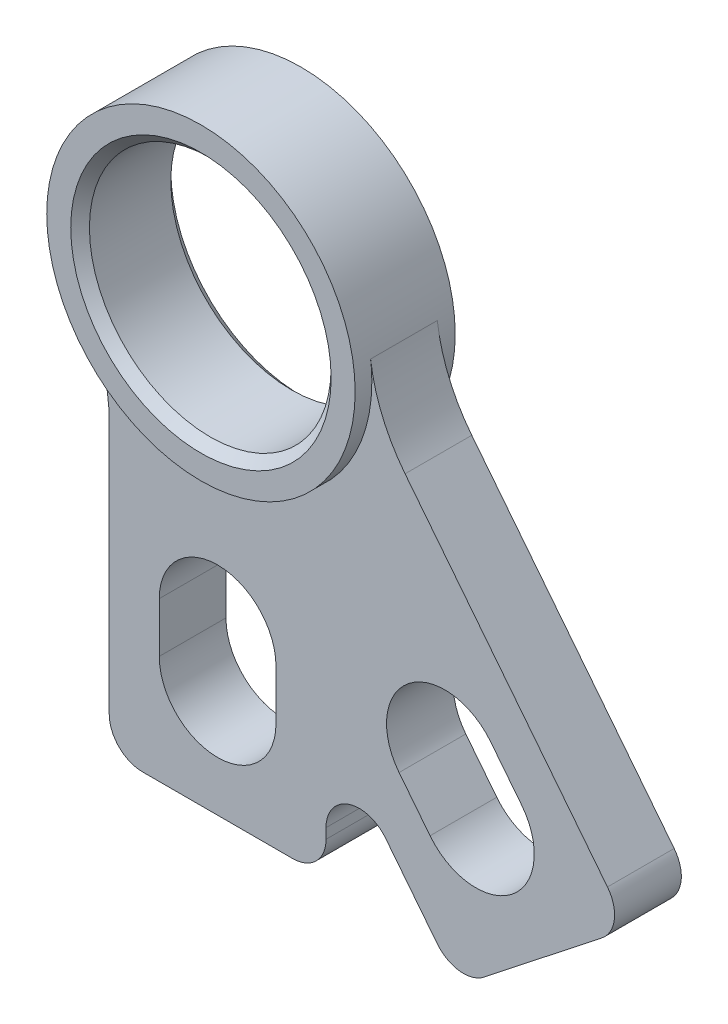
ISO-10303-21;
HEADER;
FILE_DESCRIPTION(('STEP AP214'),'2;1');
FILE_NAME('part.step','',(''),(''),'','','');
FILE_SCHEMA(('AUTOMOTIVE_DESIGN { 1 0 10303 214 1 1 1 1 }'));
ENDSEC;
DATA;
#1=APPLICATION_CONTEXT('core data for automotive mechanical design processes');
#2=APPLICATION_PROTOCOL_DEFINITION('international standard','automotive_design',2000,#1);
#3=PRODUCT_CONTEXT('',#1,'mechanical');
#4=PRODUCT('Part','Part','',(#3));
#5=PRODUCT_RELATED_PRODUCT_CATEGORY('part','',(#4));
#6=PRODUCT_DEFINITION_FORMATION('','',#4);
#7=PRODUCT_DEFINITION_CONTEXT('part definition',#1,'design');
#8=PRODUCT_DEFINITION('design','',#6,#7);
#9=PRODUCT_DEFINITION_SHAPE('','',#8);
#10=(LENGTH_UNIT() NAMED_UNIT(*) SI_UNIT(.MILLI.,.METRE.));
#11=(NAMED_UNIT(*) PLANE_ANGLE_UNIT() SI_UNIT($,.RADIAN.));
#12=(NAMED_UNIT(*) SI_UNIT($,.STERADIAN.) SOLID_ANGLE_UNIT());
#13=UNCERTAINTY_MEASURE_WITH_UNIT(LENGTH_MEASURE(1.E-05),#10,'distance_accuracy_value','');
#14=(GEOMETRIC_REPRESENTATION_CONTEXT(3) GLOBAL_UNCERTAINTY_ASSIGNED_CONTEXT((#13)) GLOBAL_UNIT_ASSIGNED_CONTEXT((#10,
#11,#12)) REPRESENTATION_CONTEXT('',''));
#15=CARTESIAN_POINT('',(0.,0.,0.));
#16=DIRECTION('',(0.,0.,1.));
#17=DIRECTION('',(1.,0.,0.));
#18=AXIS2_PLACEMENT_3D('',#15,#16,#17);
#19=CARTESIAN_POINT('',(0.,0.,4.7625));
#20=DIRECTION('',(0.,0.,-1.));
#21=DIRECTION('',(-1.,0.,0.));
#22=AXIS2_PLACEMENT_3D('',#19,#20,#21);
#23=CYLINDRICAL_SURFACE('',#22,11.5062);
#24=CARTESIAN_POINT('',(0.,0.,-3.87350000000003));
#25=DIRECTION('',(0.,0.,1.));
#26=DIRECTION('',(1.,0.,0.));
#27=AXIS2_PLACEMENT_3D('',#24,#25,#26);
#28=CIRCLE('',#27,11.5062);
#29=CARTESIAN_POINT('',(-11.5062,0.,-3.87350000000003));
#30=VERTEX_POINT('',#29);
#31=EDGE_CURVE('E44',#30,#30,#28,.F.);
#32=CARTESIAN_POINT('',(0.,0.,3.87349999999998));
#33=DIRECTION('',(0.,0.,1.));
#34=DIRECTION('',(1.,0.,0.));
#35=AXIS2_PLACEMENT_3D('',#32,#33,#34);
#36=CIRCLE('',#35,11.5062);
#37=CARTESIAN_POINT('',(-11.5062,0.,3.87349999999998));
#38=VERTEX_POINT('',#37);
#39=EDGE_CURVE('E371',#38,#38,#36,.T.);
#40=CARTESIAN_POINT('',(-11.5062,0.,-3.87350000000003));
#41=CARTESIAN_POINT('',(-11.5062,0.,-3.79280208333336));
#42=CARTESIAN_POINT('',(-11.5062,0.,-3.7121041666667));
#43=CARTESIAN_POINT('',(-11.5062,0.,-3.55070833333336));
#44=CARTESIAN_POINT('',(-11.5062,0.,-3.4700104166667));
#45=CARTESIAN_POINT('',(-11.5062,0.,-3.30861458333336));
#46=CARTESIAN_POINT('',(-11.5062,0.,-3.2279166666667));
#47=CARTESIAN_POINT('',(-11.5062,0.,-3.06652083333336));
#48=CARTESIAN_POINT('',(-11.5062,0.,-2.9858229166667));
#49=CARTESIAN_POINT('',(-11.5062,0.,-2.82442708333336));
#50=CARTESIAN_POINT('',(-11.5062,0.,-2.7437291666667));
#51=CARTESIAN_POINT('',(-11.5062,0.,-2.58233333333336));
#52=CARTESIAN_POINT('',(-11.5062,0.,-2.5016354166667));
#53=CARTESIAN_POINT('',(-11.5062,0.,-2.34023958333336));
#54=CARTESIAN_POINT('',(-11.5062,0.,-2.2595416666667));
#55=CARTESIAN_POINT('',(-11.5062,0.,-2.09814583333336));
#56=CARTESIAN_POINT('',(-11.5062,0.,-2.0174479166667));
#57=CARTESIAN_POINT('',(-11.5062,0.,-1.85605208333336));
#58=CARTESIAN_POINT('',(-11.5062,0.,-1.7753541666667));
#59=CARTESIAN_POINT('',(-11.5062,0.,-1.61395833333336));
#60=CARTESIAN_POINT('',(-11.5062,0.,-1.5332604166667));
#61=CARTESIAN_POINT('',(-11.5062,0.,-1.37186458333336));
#62=CARTESIAN_POINT('',(-11.5062,0.,-1.29116666666669));
#63=CARTESIAN_POINT('',(-11.5062,0.,-1.12977083333336));
#64=CARTESIAN_POINT('',(-11.5062,0.,-1.04907291666669));
#65=CARTESIAN_POINT('',(-11.5062,0.,-0.887677083333362));
#66=CARTESIAN_POINT('',(-11.5062,0.,-0.806979166666695));
#67=CARTESIAN_POINT('',(-11.5062,0.,-0.645583333333361));
#68=CARTESIAN_POINT('',(-11.5062,0.,-0.564885416666695));
#69=CARTESIAN_POINT('',(-11.5062,0.,-0.403489583333361));
#70=CARTESIAN_POINT('',(-11.5062,0.,-0.322791666666694));
#71=CARTESIAN_POINT('',(-11.5062,0.,-0.16139583333336));
#72=CARTESIAN_POINT('',(-11.5062,0.,-0.0806979166666936));
#73=CARTESIAN_POINT('',(-11.5062,0.,0.0806979166666398));
#74=CARTESIAN_POINT('',(-11.5062,0.,0.161395833333307));
#75=CARTESIAN_POINT('',(-11.5062,0.,0.32279166666664));
#76=CARTESIAN_POINT('',(-11.5062,0.,0.403489583333307));
#77=CARTESIAN_POINT('',(-11.5062,0.,0.56488541666664));
#78=CARTESIAN_POINT('',(-11.5062,0.,0.645583333333307));
#79=CARTESIAN_POINT('',(-11.5062,0.,0.806979166666641));
#80=CARTESIAN_POINT('',(-11.5062,0.,0.887677083333308));
#81=CARTESIAN_POINT('',(-11.5062,0.,1.04907291666664));
#82=CARTESIAN_POINT('',(-11.5062,0.,1.12977083333331));
#83=CARTESIAN_POINT('',(-11.5062,0.,1.29116666666664));
#84=CARTESIAN_POINT('',(-11.5062,0.,1.37186458333331));
#85=CARTESIAN_POINT('',(-11.5062,0.,1.53326041666664));
#86=CARTESIAN_POINT('',(-11.5062,0.,1.61395833333331));
#87=CARTESIAN_POINT('',(-11.5062,0.,1.77535416666664));
#88=CARTESIAN_POINT('',(-11.5062,0.,1.85605208333331));
#89=CARTESIAN_POINT('',(-11.5062,0.,2.01744791666664));
#90=CARTESIAN_POINT('',(-11.5062,0.,2.09814583333331));
#91=CARTESIAN_POINT('',(-11.5062,0.,2.25954166666664));
#92=CARTESIAN_POINT('',(-11.5062,0.,2.34023958333331));
#93=CARTESIAN_POINT('',(-11.5062,0.,2.50163541666664));
#94=CARTESIAN_POINT('',(-11.5062,0.,2.58233333333331));
#95=CARTESIAN_POINT('',(-11.5062,0.,2.74372916666664));
#96=CARTESIAN_POINT('',(-11.5062,0.,2.82442708333331));
#97=CARTESIAN_POINT('',(-11.5062,0.,2.98582291666664));
#98=CARTESIAN_POINT('',(-11.5062,0.,3.06652083333331));
#99=CARTESIAN_POINT('',(-11.5062,0.,3.22791666666664));
#100=CARTESIAN_POINT('',(-11.5062,0.,3.30861458333331));
#101=CARTESIAN_POINT('',(-11.5062,0.,3.47001041666664));
#102=CARTESIAN_POINT('',(-11.5062,0.,3.55070833333331));
#103=CARTESIAN_POINT('',(-11.5062,0.,3.71210416666664));
#104=CARTESIAN_POINT('',(-11.5062,0.,3.79280208333331));
#105=CARTESIAN_POINT('',(-11.5062,0.,3.87349999999998));
#106=B_SPLINE_CURVE_WITH_KNOTS('',3,(#40,#41,#42,#43,#44,#45,#46,#47,#48,#49,#50,#51,#52,#53,
#54,#55,#56,#57,#58,#59,#60,#61,#62,#63,#64,#65,#66,#67,#68,#69,#70,#71,#72,#73,#74,#75,#76,#77,
#78,#79,#80,#81,#82,#83,#84,#85,#86,#87,#88,#89,#90,#91,#92,#93,#94,#95,#96,#97,#98,#99,#100,
#101,#102,#103,#104,#105),.UNSPECIFIED.,.F.,.F.,(4,2,2,2,2,2,2,2,2,2,2,2,2,2,2,2,2,2,2,2,2,2,2,
2,2,2,2,2,2,2,2,2,4),(0.,0.24209375,0.4841875,0.72628125,0.968375,1.21046875,1.4525625,
1.69465625,1.93675,2.17884375,2.4209375,2.66303125,2.905125,3.14721875,3.3893125,3.63140625,
3.8735,4.11559375,4.3576875,4.59978125,4.841875,5.08396875,5.3260625,5.56815625,5.81025,
6.05234375000001,6.29443750000001,6.53653125000001,6.77862500000001,7.02071875000001,
7.26281250000001,7.50490625000001,7.74700000000001),.UNSPECIFIED.);
#107=EDGE_CURVE('BSEAM36',#30,#38,#106,.T.);
#108=ORIENTED_EDGE('',*,*,#31,.T.);
#109=ORIENTED_EDGE('',*,*,#39,.T.);
#110=ORIENTED_EDGE('',*,*,#107,.T.);
#111=ORIENTED_EDGE('',*,*,#107,.F.);
#112=EDGE_LOOP('',(#108,#110,#109,#111));
#113=FACE_BOUND('',#112,.T.);
#114=ADVANCED_FACE('F36',(#113),#23,.F.);
#115=CARTESIAN_POINT('',(0.,0.,4.7625));
#116=DIRECTION('',(0.,0.,-1.));
#117=DIRECTION('',(-1.,0.,0.));
#118=AXIS2_PLACEMENT_3D('',#115,#116,#117);
#119=CYLINDRICAL_SURFACE('',#118,14.6812);
#120=DIRECTION('',(0.,0.,-1.));
#121=VECTOR('',#120,1.);
#122=CARTESIAN_POINT('',(-12.5851932668321,-7.55979787272684,3.175));
#123=LINE('',#122,#121);
#124=CARTESIAN_POINT('',(-12.585193266832,-7.55979787272684,3.175));
#125=VERTEX_POINT('',#124);
#126=CARTESIAN_POINT('',(-12.5851932668321,-7.55979787272684,-3.175));
#127=VERTEX_POINT('',#126);
#128=EDGE_CURVE('E198',#125,#127,#123,.T.);
#129=ORIENTED_EDGE('',*,*,#128,.F.);
#130=CARTESIAN_POINT('',(0.,0.,3.175));
#131=DIRECTION('',(0.,0.,1.));
#132=DIRECTION('',(1.,0.,0.));
#133=AXIS2_PLACEMENT_3D('',#130,#131,#132);
#134=CIRCLE('',#133,14.6812);
#135=CARTESIAN_POINT('',(14.5632437606907,1.85730035446753,3.175));
#136=VERTEX_POINT('',#135);
#137=EDGE_CURVE('E214',#125,#136,#134,.T.);
#138=ORIENTED_EDGE('',*,*,#137,.T.);
#139=DIRECTION('',(0.,0.,-1.));
#140=VECTOR('',#139,1.);
#141=CARTESIAN_POINT('',(14.5632437606906,1.85730035446752,3.175));
#142=LINE('',#141,#140);
#143=CARTESIAN_POINT('',(14.5632437606906,1.85730035446752,-3.175));
#144=VERTEX_POINT('',#143);
#145=EDGE_CURVE('E254',#136,#144,#142,.T.);
#146=ORIENTED_EDGE('',*,*,#145,.T.);
#147=CARTESIAN_POINT('',(0.,0.,-3.175));
#148=DIRECTION('',(0.,0.,1.));
#149=DIRECTION('',(1.,0.,0.));
#150=AXIS2_PLACEMENT_3D('',#147,#148,#149);
#151=CIRCLE('',#150,14.6812);
#152=EDGE_CURVE('E255',#127,#144,#151,.T.);
#153=ORIENTED_EDGE('',*,*,#152,.F.);
#154=EDGE_LOOP('',(#129,#138,#146,#153));
#155=FACE_BOUND('',#154,.T.);
#156=CARTESIAN_POINT('',(0.,0.,4.7625));
#157=DIRECTION('',(0.,0.,1.));
#158=DIRECTION('',(1.,0.,0.));
#159=AXIS2_PLACEMENT_3D('',#156,#157,#158);
#160=CIRCLE('',#159,14.6812);
#161=CARTESIAN_POINT('',(14.6812,0.,4.7625));
#162=VERTEX_POINT('',#161);
#163=EDGE_CURVE('E321',#162,#162,#160,.T.);
#164=ORIENTED_EDGE('',*,*,#163,.F.);
#165=EDGE_LOOP('',(#164));
#166=FACE_BOUND('',#165,.T.);
#167=CARTESIAN_POINT('',(0.,0.,-4.7625));
#168=DIRECTION('',(0.,0.,1.));
#169=DIRECTION('',(1.,0.,0.));
#170=AXIS2_PLACEMENT_3D('',#167,#168,#169);
#171=CIRCLE('',#170,14.6812);
#172=CARTESIAN_POINT('',(14.6812,0.,-4.7625));
#173=VERTEX_POINT('',#172);
#174=EDGE_CURVE('E309',#173,#173,#171,.T.);
#175=ORIENTED_EDGE('',*,*,#174,.T.);
#176=EDGE_LOOP('',(#175));
#177=FACE_BOUND('',#176,.T.);
#178=ADVANCED_FACE('F392',(#155,#166,#177),#119,.T.);
#179=CARTESIAN_POINT('',(0.,0.,4.7625));
#180=DIRECTION('',(0.,0.,1.));
#181=DIRECTION('',(1.,0.,0.));
#182=AXIS2_PLACEMENT_3D('',#179,#180,#181);
#183=PLANE('',#182);
#184=CARTESIAN_POINT('',(0.,0.,4.7625));
#185=DIRECTION('',(0.,0.,1.));
#186=DIRECTION('',(1.,0.,0.));
#187=AXIS2_PLACEMENT_3D('',#184,#185,#186);
#188=CIRCLE('',#187,12.3952);
#189=CARTESIAN_POINT('',(12.3952,0.,4.7625));
#190=VERTEX_POINT('',#189);
#191=EDGE_CURVE('E11',#190,#190,#188,.F.);
#192=ORIENTED_EDGE('',*,*,#191,.T.);
#193=EDGE_LOOP('',(#192));
#194=FACE_BOUND('',#193,.T.);
#195=ORIENTED_EDGE('',*,*,#163,.T.);
#196=EDGE_LOOP('',(#195));
#197=FACE_BOUND('',#196,.T.);
#198=ADVANCED_FACE('F388',(#194,#197),#183,.T.);
#199=CARTESIAN_POINT('',(0.,0.,-4.7625));
#200=DIRECTION('',(0.,0.,1.));
#201=DIRECTION('',(1.,0.,0.));
#202=AXIS2_PLACEMENT_3D('',#199,#200,#201);
#203=PLANE('',#202);
#204=CARTESIAN_POINT('',(0.,0.,-4.7625));
#205=DIRECTION('',(0.,0.,1.));
#206=DIRECTION('',(1.,0.,0.));
#207=AXIS2_PLACEMENT_3D('',#204,#205,#206);
#208=CIRCLE('',#207,12.3952);
#209=CARTESIAN_POINT('',(12.3952,0.,-4.7625));
#210=VERTEX_POINT('',#209);
#211=EDGE_CURVE('E368',#210,#210,#208,.T.);
#212=ORIENTED_EDGE('',*,*,#211,.T.);
#213=EDGE_LOOP('',(#212));
#214=FACE_BOUND('',#213,.T.);
#215=ORIENTED_EDGE('',*,*,#174,.F.);
#216=EDGE_LOOP('',(#215));
#217=FACE_BOUND('',#216,.T.);
#218=ADVANCED_FACE('F384',(#214,#217),#203,.F.);
#219=CARTESIAN_POINT('',(0.,-27.9580697939255,3.175));
#220=DIRECTION('',(0.,0.,-1.));
#221=DIRECTION('',(-1.,0.,0.));
#222=AXIS2_PLACEMENT_3D('',#219,#220,#221);
#223=CYLINDRICAL_SURFACE('',#222,5.55624999999843);
#224=CARTESIAN_POINT('',(0.,-27.9580697939255,-3.175));
#225=DIRECTION('',(0.,0.,1.));
#226=DIRECTION('',(1.,0.,0.));
#227=AXIS2_PLACEMENT_3D('',#224,#225,#226);
#228=CIRCLE('',#227,5.55624999999843);
#229=CARTESIAN_POINT('',(5.55624999999843,-27.9580697939256,-3.175));
#230=VERTEX_POINT('',#229);
#231=CARTESIAN_POINT('',(-5.55624999999843,-27.9580697939256,-3.175));
#232=VERTEX_POINT('',#231);
#233=EDGE_CURVE('E289',#230,#232,#228,.T.);
#234=ORIENTED_EDGE('',*,*,#233,.F.);
#235=DIRECTION('',(0.,0.,-1.));
#236=VECTOR('',#235,1.);
#237=CARTESIAN_POINT('',(5.55624999999843,-27.9580697939256,3.175));
#238=LINE('',#237,#236);
#239=CARTESIAN_POINT('',(5.55624999999843,-27.9580697939256,3.175));
#240=VERTEX_POINT('',#239);
#241=EDGE_CURVE('E307',#240,#230,#238,.T.);
#242=ORIENTED_EDGE('',*,*,#241,.F.);
#243=CARTESIAN_POINT('',(0.,-27.9580697939255,3.175));
#244=DIRECTION('',(0.,0.,1.));
#245=DIRECTION('',(1.,0.,0.));
#246=AXIS2_PLACEMENT_3D('',#243,#244,#245);
#247=CIRCLE('',#246,5.55624999999843);
#248=CARTESIAN_POINT('',(-5.55624999999843,-27.9580697939256,3.175));
#249=VERTEX_POINT('',#248);
#250=EDGE_CURVE('E243',#240,#249,#247,.T.);
#251=ORIENTED_EDGE('',*,*,#250,.T.);
#252=DIRECTION('',(0.,0.,-1.));
#253=VECTOR('',#252,1.);
#254=CARTESIAN_POINT('',(-5.55624999999843,-27.9580697939256,3.175));
#255=LINE('',#254,#253);
#256=EDGE_CURVE('E300',#249,#232,#255,.T.);
#257=ORIENTED_EDGE('',*,*,#256,.T.);
#258=EDGE_LOOP('',(#234,#242,#251,#257));
#259=FACE_BOUND('',#258,.T.);
#260=ADVANCED_FACE('F387',(#259),#223,.F.);
#261=CARTESIAN_POINT('',(5.55624999999843,0.,3.175));
#262=DIRECTION('',(-1.,0.,0.));
#263=DIRECTION('',(0.,0.,1.));
#264=AXIS2_PLACEMENT_3D('',#261,#262,#263);
#265=PLANE('',#264);
#266=DIRECTION('',(0.,1.,0.));
#267=VECTOR('',#266,1.);
#268=CARTESIAN_POINT('',(5.55624999999843,0.,-3.175));
#269=LINE('',#268,#267);
#270=CARTESIAN_POINT('',(5.55624999999843,-32.7205697939288,-3.175));
#271=VERTEX_POINT('',#270);
#272=EDGE_CURVE('E292',#271,#230,#269,.T.);
#273=ORIENTED_EDGE('',*,*,#272,.F.);
#274=DIRECTION('',(0.,0.,-1.));
#275=VECTOR('',#274,1.);
#276=CARTESIAN_POINT('',(5.55624999999843,-32.7205697939288,3.175));
#277=LINE('',#276,#275);
#278=CARTESIAN_POINT('',(5.55624999999843,-32.7205697939288,3.175));
#279=VERTEX_POINT('',#278);
#280=EDGE_CURVE('E305',#279,#271,#277,.T.);
#281=ORIENTED_EDGE('',*,*,#280,.F.);
#282=DIRECTION('',(0.,1.,0.));
#283=VECTOR('',#282,1.);
#284=CARTESIAN_POINT('',(5.55624999999843,0.,3.175));
#285=LINE('',#284,#283);
#286=EDGE_CURVE('E246',#279,#240,#285,.T.);
#287=ORIENTED_EDGE('',*,*,#286,.T.);
#288=ORIENTED_EDGE('',*,*,#241,.T.);
#289=EDGE_LOOP('',(#273,#281,#287,#288));
#290=FACE_BOUND('',#289,.T.);
#291=ADVANCED_FACE('F531',(#290),#265,.T.);
#292=CARTESIAN_POINT('',(0.,-32.7205697939288,3.175));
#293=DIRECTION('',(0.,0.,-1.));
#294=DIRECTION('',(-1.,0.,0.));
#295=AXIS2_PLACEMENT_3D('',#292,#293,#294);
#296=CYLINDRICAL_SURFACE('',#295,5.55624999999843);
#297=CARTESIAN_POINT('',(0.,-32.7205697939288,-3.175));
#298=DIRECTION('',(0.,0.,1.));
#299=DIRECTION('',(1.,0.,0.));
#300=AXIS2_PLACEMENT_3D('',#297,#298,#299);
#301=CIRCLE('',#300,5.55624999999843);
#302=CARTESIAN_POINT('',(-5.55624999999843,-32.7205697939288,-3.175));
#303=VERTEX_POINT('',#302);
#304=EDGE_CURVE('E295',#303,#271,#301,.T.);
#305=ORIENTED_EDGE('',*,*,#304,.F.);
#306=DIRECTION('',(0.,0.,-1.));
#307=VECTOR('',#306,1.);
#308=CARTESIAN_POINT('',(-5.55624999999843,-32.7205697939288,3.175));
#309=LINE('',#308,#307);
#310=CARTESIAN_POINT('',(-5.55624999999843,-32.7205697939288,3.175));
#311=VERTEX_POINT('',#310);
#312=EDGE_CURVE('E302',#311,#303,#309,.T.);
#313=ORIENTED_EDGE('',*,*,#312,.F.);
#314=CARTESIAN_POINT('',(0.,-32.7205697939288,3.175));
#315=DIRECTION('',(0.,0.,1.));
#316=DIRECTION('',(1.,0.,0.));
#317=AXIS2_PLACEMENT_3D('',#314,#315,#316);
#318=CIRCLE('',#317,5.55624999999843);
#319=EDGE_CURVE('E249',#311,#279,#318,.T.);
#320=ORIENTED_EDGE('',*,*,#319,.T.);
#321=ORIENTED_EDGE('',*,*,#280,.T.);
#322=EDGE_LOOP('',(#305,#313,#320,#321));
#323=FACE_BOUND('',#322,.T.);
#324=ADVANCED_FACE('F498',(#323),#296,.F.);
#325=CARTESIAN_POINT('',(21.6381690717061,-27.437342543465,3.175));
#326=DIRECTION('',(0.,0.,-1.));
#327=DIRECTION('',(-1.,0.,0.));
#328=AXIS2_PLACEMENT_3D('',#325,#326,#327);
#329=CYLINDRICAL_SURFACE('',#328,5.55624999999847);
#330=CARTESIAN_POINT('',(21.6381690717061,-27.437342543465,-3.175));
#331=DIRECTION('',(0.,0.,1.));
#332=DIRECTION('',(1.,0.,0.));
#333=AXIS2_PLACEMENT_3D('',#330,#331,#332);
#334=CIRCLE('',#333,5.55624999999847);
#335=CARTESIAN_POINT('',(26.0009435905489,-23.9966867106012,-3.175));
#336=VERTEX_POINT('',#335);
#337=CARTESIAN_POINT('',(17.2753945528633,-30.8779983763286,-3.175));
#338=VERTEX_POINT('',#337);
#339=EDGE_CURVE('E277',#336,#338,#334,.T.);
#340=ORIENTED_EDGE('',*,*,#339,.F.);
#341=DIRECTION('',(0.,0.,-1.));
#342=VECTOR('',#341,1.);
#343=CARTESIAN_POINT('',(26.0009435905489,-23.9966867106012,3.175));
#344=LINE('',#343,#342);
#345=CARTESIAN_POINT('',(26.0009435905489,-23.9966867106012,3.175));
#346=VERTEX_POINT('',#345);
#347=EDGE_CURVE('E303',#346,#336,#344,.T.);
#348=ORIENTED_EDGE('',*,*,#347,.F.);
#349=CARTESIAN_POINT('',(21.6381690717061,-27.437342543465,3.175));
#350=DIRECTION('',(0.,0.,1.));
#351=DIRECTION('',(1.,0.,0.));
#352=AXIS2_PLACEMENT_3D('',#349,#350,#351);
#353=CIRCLE('',#352,5.55624999999847);
#354=CARTESIAN_POINT('',(17.2753945528633,-30.8779983763286,3.175));
#355=VERTEX_POINT('',#354);
#356=EDGE_CURVE('E232',#346,#355,#353,.T.);
#357=ORIENTED_EDGE('',*,*,#356,.T.);
#358=DIRECTION('',(0.,0.,-1.));
#359=VECTOR('',#358,1.);
#360=CARTESIAN_POINT('',(17.2753945528633,-30.8779983763286,3.175));
#361=LINE('',#360,#359);
#362=EDGE_CURVE('E310',#355,#338,#361,.T.);
#363=ORIENTED_EDGE('',*,*,#362,.T.);
#364=EDGE_LOOP('',(#340,#348,#357,#363));
#365=FACE_BOUND('',#364,.T.);
#366=ADVANCED_FACE('F490',(#365),#329,.F.);
#367=CARTESIAN_POINT('',(4.36277451884277,3.44065583286368,3.175));
#368=DIRECTION('',(-0.785201263234015,-0.619240644835032,0.));
#369=DIRECTION('',(0.619240644835032,-0.785201263234015,0.));
#370=AXIS2_PLACEMENT_3D('',#367,#368,#369);
#371=PLANE('',#370);
#372=DIRECTION('',(-0.619240644835032,0.785201263234015,0.));
#373=VECTOR('',#372,1.);
#374=CARTESIAN_POINT('',(4.36277451884277,3.44065583286368,-3.175));
#375=LINE('',#374,#373);
#376=CARTESIAN_POINT('',(28.9500771615778,-27.7362077267558,-3.175));
#377=VERTEX_POINT('',#376);
#378=EDGE_CURVE('E280',#377,#336,#375,.T.);
#379=ORIENTED_EDGE('',*,*,#378,.F.);
#380=DIRECTION('',(0.,0.,-1.));
#381=VECTOR('',#380,1.);
#382=CARTESIAN_POINT('',(28.9500771615778,-27.7362077267558,3.175));
#383=LINE('',#382,#381);
#384=CARTESIAN_POINT('',(28.9500771615778,-27.7362077267558,3.175));
#385=VERTEX_POINT('',#384);
#386=EDGE_CURVE('E314',#385,#377,#383,.T.);
#387=ORIENTED_EDGE('',*,*,#386,.F.);
#388=DIRECTION('',(-0.619240644835032,0.785201263234015,0.));
#389=VECTOR('',#388,1.);
#390=CARTESIAN_POINT('',(4.36277451884277,3.44065583286368,3.175));
#391=LINE('',#390,#389);
#392=EDGE_CURVE('E235',#385,#346,#391,.T.);
#393=ORIENTED_EDGE('',*,*,#392,.T.);
#394=ORIENTED_EDGE('',*,*,#347,.T.);
#395=EDGE_LOOP('',(#379,#387,#393,#394));
#396=FACE_BOUND('',#395,.T.);
#397=ADVANCED_FACE('F484',(#396),#371,.T.);
#398=CARTESIAN_POINT('',(24.5873026427349,-31.1768635596195,3.175));
#399=DIRECTION('',(0.,0.,-1.));
#400=DIRECTION('',(-1.,0.,0.));
#401=AXIS2_PLACEMENT_3D('',#398,#399,#400);
#402=CYLINDRICAL_SURFACE('',#401,5.55624999999847);
#403=CARTESIAN_POINT('',(24.5873026427349,-31.1768635596195,-3.175));
#404=DIRECTION('',(0.,0.,1.));
#405=DIRECTION('',(1.,0.,0.));
#406=AXIS2_PLACEMENT_3D('',#403,#404,#405);
#407=CIRCLE('',#406,5.55624999999847);
#408=CARTESIAN_POINT('',(20.2245281238922,-34.6175193924832,-3.175));
#409=VERTEX_POINT('',#408);
#410=EDGE_CURVE('E283',#409,#377,#407,.T.);
#411=ORIENTED_EDGE('',*,*,#410,.F.);
#412=DIRECTION('',(0.,0.,-1.));
#413=VECTOR('',#412,1.);
#414=CARTESIAN_POINT('',(20.2245281238922,-34.6175193924832,3.175));
#415=LINE('',#414,#413);
#416=CARTESIAN_POINT('',(20.2245281238922,-34.6175193924832,3.175));
#417=VERTEX_POINT('',#416);
#418=EDGE_CURVE('E312',#417,#409,#415,.T.);
#419=ORIENTED_EDGE('',*,*,#418,.F.);
#420=CARTESIAN_POINT('',(24.5873026427349,-31.1768635596195,3.175));
#421=DIRECTION('',(0.,0.,1.));
#422=DIRECTION('',(1.,0.,0.));
#423=AXIS2_PLACEMENT_3D('',#420,#421,#422);
#424=CIRCLE('',#423,5.55624999999847);
#425=EDGE_CURVE('E238',#417,#385,#424,.T.);
#426=ORIENTED_EDGE('',*,*,#425,.T.);
#427=ORIENTED_EDGE('',*,*,#386,.T.);
#428=EDGE_LOOP('',(#411,#419,#426,#427));
#429=FACE_BOUND('',#428,.T.);
#430=ADVANCED_FACE('F480',(#429),#402,.F.);
#431=CARTESIAN_POINT('',(-26.1937499999968,-15.7343197939272,3.175));
#432=DIRECTION('',(0.,0.,-1.));
#433=DIRECTION('',(-1.,0.,0.));
#434=AXIS2_PLACEMENT_3D('',#431,#432,#433);
#435=CYLINDRICAL_SURFACE('',#434,15.8749999999984);
#436=CARTESIAN_POINT('',(-26.1937499999968,-15.7343197939272,-3.175));
#437=DIRECTION('',(0.,0.,1.));
#438=DIRECTION('',(1.,0.,0.));
#439=AXIS2_PLACEMENT_3D('',#436,#437,#438);
#440=CIRCLE('',#439,15.8749999999984);
#441=CARTESIAN_POINT('',(-10.3187499999984,-15.7343197939272,-3.175));
#442=VERTEX_POINT('',#441);
#443=EDGE_CURVE('E194',#442,#127,#440,.T.);
#444=ORIENTED_EDGE('',*,*,#443,.F.);
#445=DIRECTION('',(0.,0.,-1.));
#446=VECTOR('',#445,1.);
#447=CARTESIAN_POINT('',(-10.3187499999984,-15.7343197939272,3.175));
#448=LINE('',#447,#446);
#449=CARTESIAN_POINT('',(-10.3187499999984,-15.7343197939272,3.175));
#450=VERTEX_POINT('',#449);
#451=EDGE_CURVE('E187',#450,#442,#448,.T.);
#452=ORIENTED_EDGE('',*,*,#451,.F.);
#453=CARTESIAN_POINT('',(-26.1937499999968,-15.7343197939272,3.175));
#454=DIRECTION('',(0.,0.,1.));
#455=DIRECTION('',(1.,0.,0.));
#456=AXIS2_PLACEMENT_3D('',#453,#454,#455);
#457=CIRCLE('',#456,15.8749999999984);
#458=EDGE_CURVE('E192',#450,#125,#457,.T.);
#459=ORIENTED_EDGE('',*,*,#458,.T.);
#460=ORIENTED_EDGE('',*,*,#128,.T.);
#461=EDGE_LOOP('',(#444,#452,#459,#460));
#462=FACE_BOUND('',#461,.T.);
#463=ADVANCED_FACE('F189',(#462),#435,.F.);
#464=CARTESIAN_POINT('',(-10.3187499999984,0.,3.175));
#465=DIRECTION('',(1.,0.,0.));
#466=DIRECTION('',(0.,1.,0.));
#467=AXIS2_PLACEMENT_3D('',#464,#465,#466);
#468=PLANE('',#467);
#469=DIRECTION('',(0.,-1.,0.));
#470=VECTOR('',#469,1.);
#471=CARTESIAN_POINT('',(-10.3187499999984,0.,-3.175));
#472=LINE('',#471,#470);
#473=CARTESIAN_POINT('',(-10.3187499999984,-39.8643197939272,-3.175));
#474=VERTEX_POINT('',#473);
#475=EDGE_CURVE('E259',#442,#474,#472,.T.);
#476=ORIENTED_EDGE('',*,*,#475,.T.);
#477=DIRECTION('',(0.,0.,-1.));
#478=VECTOR('',#477,1.);
#479=CARTESIAN_POINT('',(-10.3187499999984,-39.8643197939272,3.175));
#480=LINE('',#479,#478);
#481=CARTESIAN_POINT('',(-10.3187499999984,-39.8643197939272,3.175));
#482=VERTEX_POINT('',#481);
#483=EDGE_CURVE('E205',#474,#482,#480,.F.);
#484=ORIENTED_EDGE('',*,*,#483,.T.);
#485=DIRECTION('',(0.,-1.,0.));
#486=VECTOR('',#485,1.);
#487=CARTESIAN_POINT('',(-10.3187499999984,0.,3.175));
#488=LINE('',#487,#486);
#489=EDGE_CURVE('E202',#450,#482,#488,.T.);
#490=ORIENTED_EDGE('',*,*,#489,.F.);
#491=ORIENTED_EDGE('',*,*,#451,.T.);
#492=EDGE_LOOP('',(#476,#484,#490,#491));
#493=FACE_BOUND('',#492,.T.);
#494=ADVANCED_FACE('F203',(#493),#468,.F.);
#495=CARTESIAN_POINT('',(0.,-43.0393197939271,3.175));
#496=DIRECTION('',(0.,1.,0.));
#497=DIRECTION('',(-1.,0.,0.));
#498=AXIS2_PLACEMENT_3D('',#495,#496,#497);
#499=PLANE('',#498);
#500=DIRECTION('',(1.,0.,0.));
#501=VECTOR('',#500,1.);
#502=CARTESIAN_POINT('',(0.,-43.0393197939271,-3.175));
#503=LINE('',#502,#501);
#504=CARTESIAN_POINT('',(-7.14374999999843,-43.0393197939271,-3.175));
#505=VERTEX_POINT('',#504);
#506=CARTESIAN_POINT('',(7.1437499999983,-43.0393197939271,-3.175));
#507=VERTEX_POINT('',#506);
#508=EDGE_CURVE('E261',#505,#507,#503,.T.);
#509=ORIENTED_EDGE('',*,*,#508,.T.);
#510=DIRECTION('',(0.,0.,-1.));
#511=VECTOR('',#510,1.);
#512=CARTESIAN_POINT('',(7.1437499999983,-43.0393197939271,3.175));
#513=LINE('',#512,#511);
#514=CARTESIAN_POINT('',(7.1437499999983,-43.0393197939271,3.175));
#515=VERTEX_POINT('',#514);
#516=EDGE_CURVE('E342',#507,#515,#513,.F.);
#517=ORIENTED_EDGE('',*,*,#516,.T.);
#518=DIRECTION('',(1.,0.,0.));
#519=VECTOR('',#518,1.);
#520=CARTESIAN_POINT('',(0.,-43.0393197939271,3.175));
#521=LINE('',#520,#519);
#522=CARTESIAN_POINT('',(-7.14374999999843,-43.0393197939271,3.175));
#523=VERTEX_POINT('',#522);
#524=EDGE_CURVE('E207',#523,#515,#521,.T.);
#525=ORIENTED_EDGE('',*,*,#524,.F.);
#526=DIRECTION('',(0.,0.,-1.));
#527=VECTOR('',#526,1.);
#528=CARTESIAN_POINT('',(-7.14374999999843,-43.0393197939271,3.175));
#529=LINE('',#528,#527);
#530=EDGE_CURVE('E339',#523,#505,#529,.T.);
#531=ORIENTED_EDGE('',*,*,#530,.T.);
#532=EDGE_LOOP('',(#509,#517,#525,#531));
#533=FACE_BOUND('',#532,.T.);
#534=ADVANCED_FACE('F444',(#533),#499,.F.);
#535=CARTESIAN_POINT('',(10.3187499999974,2.19518051354896E-13,3.175));
#536=DIRECTION('',(1.,0.,0.));
#537=DIRECTION('',(0.,1.,0.));
#538=AXIS2_PLACEMENT_3D('',#535,#536,#537);
#539=PLANE('',#538);
#540=DIRECTION('',(0.,-1.,0.));
#541=VECTOR('',#540,1.);
#542=CARTESIAN_POINT('',(10.3187499999974,2.19518051354896E-13,3.175));
#543=LINE('',#542,#541);
#544=CARTESIAN_POINT('',(10.3187499999983,-38.9009664444403,3.175));
#545=VERTEX_POINT('',#544);
#546=CARTESIAN_POINT('',(10.3187499999983,-39.8643197939271,3.175));
#547=VERTEX_POINT('',#546);
#548=EDGE_CURVE('E220',#545,#547,#543,.T.);
#549=ORIENTED_EDGE('',*,*,#548,.T.);
#550=DIRECTION('',(0.,0.,-1.));
#551=VECTOR('',#550,1.);
#552=CARTESIAN_POINT('',(10.3187499999983,-39.8643197939271,-3.175));
#553=LINE('',#552,#551);
#554=CARTESIAN_POINT('',(10.3187499999983,-39.8643197939271,-3.175));
#555=VERTEX_POINT('',#554);
#556=EDGE_CURVE('E328',#547,#555,#553,.T.);
#557=ORIENTED_EDGE('',*,*,#556,.T.);
#558=DIRECTION('',(0.,-1.,0.));
#559=VECTOR('',#558,1.);
#560=CARTESIAN_POINT('',(10.3187499999974,2.19518051354896E-13,-3.175));
#561=LINE('',#560,#559);
#562=CARTESIAN_POINT('',(10.3187499999983,-38.9009664444403,-3.175));
#563=VERTEX_POINT('',#562);
#564=EDGE_CURVE('E264',#563,#555,#561,.T.);
#565=ORIENTED_EDGE('',*,*,#564,.F.);
#566=DIRECTION('',(0.,0.,-1.));
#567=VECTOR('',#566,1.);
#568=CARTESIAN_POINT('',(10.3187499999983,-38.9009664444403,3.175));
#569=LINE('',#568,#567);
#570=EDGE_CURVE('E324',#563,#545,#569,.F.);
#571=ORIENTED_EDGE('',*,*,#570,.T.);
#572=EDGE_LOOP('',(#549,#557,#565,#571));
#573=FACE_BOUND('',#572,.T.);
#574=ADVANCED_FACE('F450',(#573),#539,.T.);
#575=CARTESIAN_POINT('',(-8.10229553499473,-6.38978940389047,3.175));
#576=DIRECTION('',(-0.785201263234017,-0.61924064483503,0.));
#577=DIRECTION('',(0.619240644835031,-0.785201263234017,0.));
#578=AXIS2_PLACEMENT_3D('',#575,#576,#577);
#579=PLANE('',#578);
#580=DIRECTION('',(-0.619240644835031,0.785201263234017,0.));
#581=VECTOR('',#580,1.);
#582=CARTESIAN_POINT('',(-8.10229553499473,-6.38978940389047,-3.175));
#583=LINE('',#582,#581);
#584=CARTESIAN_POINT('',(20.9087074642795,-43.1759344877367,-3.175));
#585=VERTEX_POINT('',#584);
#586=CARTESIAN_POINT('',(15.9867640107663,-36.934877397089,-3.175));
#587=VERTEX_POINT('',#586);
#588=EDGE_CURVE('E267',#585,#587,#583,.T.);
#589=ORIENTED_EDGE('',*,*,#588,.F.);
#590=DIRECTION('',(0.,0.,-1.));
#591=VECTOR('',#590,1.);
#592=CARTESIAN_POINT('',(20.9087074642795,-43.1759344877367,3.175));
#593=LINE('',#592,#591);
#594=CARTESIAN_POINT('',(20.9087074642795,-43.1759344877367,3.175));
#595=VERTEX_POINT('',#594);
#596=EDGE_CURVE('E358',#585,#595,#593,.F.);
#597=ORIENTED_EDGE('',*,*,#596,.T.);
#598=DIRECTION('',(-0.619240644835031,0.785201263234017,0.));
#599=VECTOR('',#598,1.);
#600=CARTESIAN_POINT('',(-8.10229553499473,-6.38978940389047,3.175));
#601=LINE('',#600,#599);
#602=CARTESIAN_POINT('',(15.9867640107663,-36.934877397089,3.175));
#603=VERTEX_POINT('',#602);
#604=EDGE_CURVE('E223',#595,#603,#601,.T.);
#605=ORIENTED_EDGE('',*,*,#604,.T.);
#606=DIRECTION('',(0.,0.,-1.));
#607=VECTOR('',#606,1.);
#608=CARTESIAN_POINT('',(15.9867640107663,-36.934877397089,-3.175));
#609=LINE('',#608,#607);
#610=EDGE_CURVE('E355',#603,#587,#609,.T.);
#611=ORIENTED_EDGE('',*,*,#610,.T.);
#612=EDGE_LOOP('',(#589,#597,#605,#611));
#613=FACE_BOUND('',#612,.T.);
#614=ADVANCED_FACE('F458',(#613),#579,.T.);
#615=CARTESIAN_POINT('',(30.9770920466255,-39.2791590946142,3.175));
#616=DIRECTION('',(-0.619240644835033,0.785201263234015,0.));
#617=DIRECTION('',(-0.785201263234015,-0.619240644835033,0.));
#618=AXIS2_PLACEMENT_3D('',#615,#616,#617);
#619=PLANE('',#618);
#620=DIRECTION('',(0.785201263234015,0.619240644835033,0.));
#621=VECTOR('',#620,1.);
#622=CARTESIAN_POINT('',(30.9770920466255,-39.2791590946142,3.175));
#623=LINE('',#622,#621);
#624=CARTESIAN_POINT('',(25.3678105223987,-43.7028594511535,3.175));
#625=VERTEX_POINT('',#624);
#626=CARTESIAN_POINT('',(36.5863735708522,-34.8554587380749,3.175));
#627=VERTEX_POINT('',#626);
#628=EDGE_CURVE('E226',#625,#627,#623,.T.);
#629=ORIENTED_EDGE('',*,*,#628,.F.);
#630=DIRECTION('',(0.,0.,-1.));
#631=VECTOR('',#630,1.);
#632=CARTESIAN_POINT('',(25.3678105223987,-43.7028594511535,-3.175));
#633=LINE('',#632,#631);
#634=CARTESIAN_POINT('',(25.3678105223987,-43.7028594511535,-3.175));
#635=VERTEX_POINT('',#634);
#636=EDGE_CURVE('E352',#625,#635,#633,.T.);
#637=ORIENTED_EDGE('',*,*,#636,.T.);
#638=DIRECTION('',(0.785201263234015,0.619240644835033,0.));
#639=VECTOR('',#638,1.);
#640=CARTESIAN_POINT('',(30.9770920466255,-39.2791590946142,-3.175));
#641=LINE('',#640,#639);
#642=CARTESIAN_POINT('',(36.5863735708522,-34.8554587380749,-3.175));
#643=VERTEX_POINT('',#642);
#644=EDGE_CURVE('E270',#635,#643,#641,.T.);
#645=ORIENTED_EDGE('',*,*,#644,.T.);
#646=DIRECTION('',(0.,0.,-1.));
#647=VECTOR('',#646,1.);
#648=CARTESIAN_POINT('',(36.5863735708522,-34.8554587380749,3.175));
#649=LINE('',#648,#647);
#650=EDGE_CURVE('E59',#643,#627,#649,.F.);
#651=ORIENTED_EDGE('',*,*,#650,.T.);
#652=EDGE_LOOP('',(#629,#637,#645,#651));
#653=FACE_BOUND('',#652,.T.);
#654=ADVANCED_FACE('F461',(#653),#619,.F.);
#655=CARTESIAN_POINT('',(8.10229553499475,6.38978940389049,3.175));
#656=DIRECTION('',(-0.785201263234016,-0.619240644835031,0.));
#657=DIRECTION('',(0.619240644835031,-0.785201263234016,0.));
#658=AXIS2_PLACEMENT_3D('',#655,#656,#657);
#659=PLANE('',#658);
#660=DIRECTION('',(-0.619240644835031,0.785201263234016,0.));
#661=VECTOR('',#660,1.);
#662=CARTESIAN_POINT('',(8.10229553499475,6.38978940389049,3.175));
#663=LINE('',#662,#661);
#664=CARTESIAN_POINT('',(37.113298534269,-30.3963556799557,3.175));
#665=VERTEX_POINT('',#664);
#666=CARTESIAN_POINT('',(17.845625870227,-5.96481837442928,3.175));
#667=VERTEX_POINT('',#666);
#668=EDGE_CURVE('E228',#665,#667,#663,.T.);
#669=ORIENTED_EDGE('',*,*,#668,.F.);
#670=DIRECTION('',(0.,0.,-1.));
#671=VECTOR('',#670,1.);
#672=CARTESIAN_POINT('',(37.1132985342689,-30.3963556799557,3.175));
#673=LINE('',#672,#671);
#674=CARTESIAN_POINT('',(37.113298534269,-30.3963556799557,-3.175));
#675=VERTEX_POINT('',#674);
#676=EDGE_CURVE('E361',#665,#675,#673,.T.);
#677=ORIENTED_EDGE('',*,*,#676,.T.);
#678=DIRECTION('',(-0.619240644835031,0.785201263234016,0.));
#679=VECTOR('',#678,1.);
#680=CARTESIAN_POINT('',(8.10229553499475,6.38978940389049,-3.175));
#681=LINE('',#680,#679);
#682=CARTESIAN_POINT('',(17.845625870227,-5.96481837442928,-3.175));
#683=VERTEX_POINT('',#682);
#684=EDGE_CURVE('E272',#675,#683,#681,.T.);
#685=ORIENTED_EDGE('',*,*,#684,.T.);
#686=DIRECTION('',(0.,0.,-1.));
#687=VECTOR('',#686,1.);
#688=CARTESIAN_POINT('',(17.845625870227,-5.96481837442928,3.175));
#689=LINE('',#688,#687);
#690=EDGE_CURVE('E199',#667,#683,#689,.T.);
#691=ORIENTED_EDGE('',*,*,#690,.F.);
#692=EDGE_LOOP('',(#669,#677,#685,#691));
#693=FACE_BOUND('',#692,.T.);
#694=ADVANCED_FACE('F429',(#693),#659,.F.);
#695=CARTESIAN_POINT('',(-4.36277451884282,-3.44065583286372,3.175));
#696=DIRECTION('',(-0.785201263234015,-0.619240644835032,0.));
#697=DIRECTION('',(0.619240644835032,-0.785201263234015,0.));
#698=AXIS2_PLACEMENT_3D('',#695,#696,#697);
#699=PLANE('',#698);
#700=DIRECTION('',(-0.619240644835032,0.785201263234015,0.));
#701=VECTOR('',#700,1.);
#702=CARTESIAN_POINT('',(-4.36277451884282,-3.44065583286372,-3.175));
#703=LINE('',#702,#701);
#704=EDGE_CURVE('E286',#409,#338,#703,.T.);
#705=ORIENTED_EDGE('',*,*,#704,.T.);
#706=ORIENTED_EDGE('',*,*,#362,.F.);
#707=DIRECTION('',(-0.619240644835032,0.785201263234015,0.));
#708=VECTOR('',#707,1.);
#709=CARTESIAN_POINT('',(-4.36277451884282,-3.44065583286372,3.175));
#710=LINE('',#709,#708);
#711=EDGE_CURVE('E241',#417,#355,#710,.T.);
#712=ORIENTED_EDGE('',*,*,#711,.F.);
#713=ORIENTED_EDGE('',*,*,#418,.T.);
#714=EDGE_LOOP('',(#705,#706,#712,#713));
#715=FACE_BOUND('',#714,.T.);
#716=ADVANCED_FACE('F468',(#715),#699,.F.);
#717=CARTESIAN_POINT('',(30.3106959240656,3.86562686232581,3.175));
#718=DIRECTION('',(0.,0.,-1.));
#719=DIRECTION('',(-1.,0.,0.));
#720=AXIS2_PLACEMENT_3D('',#717,#718,#719);
#721=CYLINDRICAL_SURFACE('',#720,15.8749999999984);
#722=CARTESIAN_POINT('',(30.3106959240656,3.86562686232581,-3.175));
#723=DIRECTION('',(0.,0.,1.));
#724=DIRECTION('',(1.,0.,0.));
#725=AXIS2_PLACEMENT_3D('',#722,#723,#724);
#726=CIRCLE('',#725,15.8749999999984);
#727=EDGE_CURVE('E274',#683,#144,#726,.F.);
#728=ORIENTED_EDGE('',*,*,#727,.T.);
#729=ORIENTED_EDGE('',*,*,#145,.F.);
#730=CARTESIAN_POINT('',(30.3106959240656,3.86562686232581,3.175));
#731=DIRECTION('',(0.,0.,1.));
#732=DIRECTION('',(1.,0.,0.));
#733=AXIS2_PLACEMENT_3D('',#730,#731,#732);
#734=CIRCLE('',#733,15.8749999999984);
#735=EDGE_CURVE('E230',#667,#136,#734,.F.);
#736=ORIENTED_EDGE('',*,*,#735,.F.);
#737=ORIENTED_EDGE('',*,*,#690,.T.);
#738=EDGE_LOOP('',(#728,#729,#736,#737));
#739=FACE_BOUND('',#738,.T.);
#740=ADVANCED_FACE('F437',(#739),#721,.F.);
#741=CARTESIAN_POINT('',(-5.55624999999842,0.,3.175));
#742=DIRECTION('',(-1.,0.,0.));
#743=DIRECTION('',(0.,-1.,0.));
#744=AXIS2_PLACEMENT_3D('',#741,#742,#743);
#745=PLANE('',#744);
#746=DIRECTION('',(0.,1.,0.));
#747=VECTOR('',#746,1.);
#748=CARTESIAN_POINT('',(-5.55624999999842,0.,-3.175));
#749=LINE('',#748,#747);
#750=EDGE_CURVE('E216',#303,#232,#749,.T.);
#751=ORIENTED_EDGE('',*,*,#750,.T.);
#752=ORIENTED_EDGE('',*,*,#256,.F.);
#753=DIRECTION('',(0.,1.,0.));
#754=VECTOR('',#753,1.);
#755=CARTESIAN_POINT('',(-5.55624999999842,0.,3.175));
#756=LINE('',#755,#754);
#757=EDGE_CURVE('E252',#311,#249,#756,.T.);
#758=ORIENTED_EDGE('',*,*,#757,.F.);
#759=ORIENTED_EDGE('',*,*,#312,.T.);
#760=EDGE_LOOP('',(#751,#752,#758,#759));
#761=FACE_BOUND('',#760,.T.);
#762=ADVANCED_FACE('F501',(#761),#745,.F.);
#763=CARTESIAN_POINT('',(0.,0.,3.175));
#764=DIRECTION('',(0.,0.,1.));
#765=DIRECTION('',(1.,0.,0.));
#766=AXIS2_PLACEMENT_3D('',#763,#764,#765);
#767=PLANE('',#766);
#768=ORIENTED_EDGE('',*,*,#524,.T.);
#769=CARTESIAN_POINT('',(7.14374999999829,-39.8643197939271,3.175));
#770=DIRECTION('',(0.,0.,1.));
#771=DIRECTION('',(1.,0.,0.));
#772=AXIS2_PLACEMENT_3D('',#769,#770,#771);
#773=CIRCLE('',#772,3.175);
#774=EDGE_CURVE('E349',#515,#547,#773,.T.);
#775=ORIENTED_EDGE('',*,*,#774,.T.);
#776=ORIENTED_EDGE('',*,*,#548,.F.);
#777=CARTESIAN_POINT('',(13.4937499999983,-38.9009664444402,3.175));
#778=DIRECTION('',(0.,0.,1.));
#779=DIRECTION('',(1.,0.,0.));
#780=AXIS2_PLACEMENT_3D('',#777,#778,#779);
#781=CIRCLE('',#780,3.175);
#782=EDGE_CURVE('E366',#545,#603,#781,.F.);
#783=ORIENTED_EDGE('',*,*,#782,.T.);
#784=ORIENTED_EDGE('',*,*,#604,.F.);
#785=CARTESIAN_POINT('',(23.4017214750475,-41.2098454403855,3.175));
#786=DIRECTION('',(0.,0.,1.));
#787=DIRECTION('',(1.,0.,0.));
#788=AXIS2_PLACEMENT_3D('',#785,#786,#787);
#789=CIRCLE('',#788,3.175);
#790=EDGE_CURVE('E347',#595,#625,#789,.T.);
#791=ORIENTED_EDGE('',*,*,#790,.T.);
#792=ORIENTED_EDGE('',*,*,#628,.T.);
#793=CARTESIAN_POINT('',(34.6202845235009,-32.3624447273069,3.175));
#794=DIRECTION('',(0.,0.,1.));
#795=DIRECTION('',(1.,0.,0.));
#796=AXIS2_PLACEMENT_3D('',#793,#794,#795);
#797=CIRCLE('',#796,3.175);
#798=EDGE_CURVE('E51',#627,#665,#797,.T.);
#799=ORIENTED_EDGE('',*,*,#798,.T.);
#800=ORIENTED_EDGE('',*,*,#668,.T.);
#801=ORIENTED_EDGE('',*,*,#735,.T.);
#802=ORIENTED_EDGE('',*,*,#137,.F.);
#803=ORIENTED_EDGE('',*,*,#458,.F.);
#804=ORIENTED_EDGE('',*,*,#489,.T.);
#805=CARTESIAN_POINT('',(-7.14374999999844,-39.8643197939272,3.175));
#806=DIRECTION('',(0.,0.,1.));
#807=DIRECTION('',(1.,0.,0.));
#808=AXIS2_PLACEMENT_3D('',#805,#806,#807);
#809=CIRCLE('',#808,3.175);
#810=EDGE_CURVE('E345',#482,#523,#809,.T.);
#811=ORIENTED_EDGE('',*,*,#810,.T.);
#812=EDGE_LOOP('',(#768,#775,#776,#783,#784,#791,#792,#799,#800,#801,#802,#803,#804,#811));
#813=FACE_BOUND('',#812,.T.);
#814=ORIENTED_EDGE('',*,*,#356,.F.);
#815=ORIENTED_EDGE('',*,*,#392,.F.);
#816=ORIENTED_EDGE('',*,*,#425,.F.);
#817=ORIENTED_EDGE('',*,*,#711,.T.);
#818=EDGE_LOOP('',(#814,#815,#816,#817));
#819=FACE_BOUND('',#818,.T.);
#820=ORIENTED_EDGE('',*,*,#250,.F.);
#821=ORIENTED_EDGE('',*,*,#286,.F.);
#822=ORIENTED_EDGE('',*,*,#319,.F.);
#823=ORIENTED_EDGE('',*,*,#757,.T.);
#824=EDGE_LOOP('',(#820,#821,#822,#823));
#825=FACE_BOUND('',#824,.T.);
#826=ADVANCED_FACE('F211',(#813,#819,#825),#767,.T.);
#827=CARTESIAN_POINT('',(0.,0.,-3.175));
#828=DIRECTION('',(0.,0.,1.));
#829=DIRECTION('',(1.,0.,0.));
#830=AXIS2_PLACEMENT_3D('',#827,#828,#829);
#831=PLANE('',#830);
#832=ORIENTED_EDGE('',*,*,#564,.T.);
#833=CARTESIAN_POINT('',(7.14374999999829,-39.8643197939271,-3.175));
#834=DIRECTION('',(0.,0.,1.));
#835=DIRECTION('',(1.,0.,0.));
#836=AXIS2_PLACEMENT_3D('',#833,#834,#835);
#837=CIRCLE('',#836,3.175);
#838=EDGE_CURVE('E337',#555,#507,#837,.F.);
#839=ORIENTED_EDGE('',*,*,#838,.T.);
#840=ORIENTED_EDGE('',*,*,#508,.F.);
#841=CARTESIAN_POINT('',(-7.14374999999844,-39.8643197939272,-3.175));
#842=DIRECTION('',(0.,0.,1.));
#843=DIRECTION('',(1.,0.,0.));
#844=AXIS2_PLACEMENT_3D('',#841,#842,#843);
#845=CIRCLE('',#844,3.175);
#846=EDGE_CURVE('E333',#505,#474,#845,.F.);
#847=ORIENTED_EDGE('',*,*,#846,.T.);
#848=ORIENTED_EDGE('',*,*,#475,.F.);
#849=ORIENTED_EDGE('',*,*,#443,.T.);
#850=ORIENTED_EDGE('',*,*,#152,.T.);
#851=ORIENTED_EDGE('',*,*,#727,.F.);
#852=ORIENTED_EDGE('',*,*,#684,.F.);
#853=CARTESIAN_POINT('',(34.6202845235009,-32.3624447273069,-3.175));
#854=DIRECTION('',(0.,0.,1.));
#855=DIRECTION('',(1.,0.,0.));
#856=AXIS2_PLACEMENT_3D('',#853,#854,#855);
#857=CIRCLE('',#856,3.175);
#858=EDGE_CURVE('E331',#675,#643,#857,.F.);
#859=ORIENTED_EDGE('',*,*,#858,.T.);
#860=ORIENTED_EDGE('',*,*,#644,.F.);
#861=CARTESIAN_POINT('',(23.4017214750475,-41.2098454403855,-3.175));
#862=DIRECTION('',(0.,0.,1.));
#863=DIRECTION('',(1.,0.,0.));
#864=AXIS2_PLACEMENT_3D('',#861,#862,#863);
#865=CIRCLE('',#864,3.175);
#866=EDGE_CURVE('E335',#635,#585,#865,.F.);
#867=ORIENTED_EDGE('',*,*,#866,.T.);
#868=ORIENTED_EDGE('',*,*,#588,.T.);
#869=CARTESIAN_POINT('',(13.4937499999983,-38.9009664444402,-3.175));
#870=DIRECTION('',(0.,0.,1.));
#871=DIRECTION('',(1.,0.,0.));
#872=AXIS2_PLACEMENT_3D('',#869,#870,#871);
#873=CIRCLE('',#872,3.175);
#874=EDGE_CURVE('E364',#587,#563,#873,.T.);
#875=ORIENTED_EDGE('',*,*,#874,.T.);
#876=EDGE_LOOP('',(#832,#839,#840,#847,#848,#849,#850,#851,#852,#859,#860,#867,#868,#875));
#877=FACE_BOUND('',#876,.T.);
#878=ORIENTED_EDGE('',*,*,#339,.T.);
#879=ORIENTED_EDGE('',*,*,#704,.F.);
#880=ORIENTED_EDGE('',*,*,#410,.T.);
#881=ORIENTED_EDGE('',*,*,#378,.T.);
#882=EDGE_LOOP('',(#878,#879,#880,#881));
#883=FACE_BOUND('',#882,.T.);
#884=ORIENTED_EDGE('',*,*,#233,.T.);
#885=ORIENTED_EDGE('',*,*,#750,.F.);
#886=ORIENTED_EDGE('',*,*,#304,.T.);
#887=ORIENTED_EDGE('',*,*,#272,.T.);
#888=EDGE_LOOP('',(#884,#885,#886,#887));
#889=FACE_BOUND('',#888,.T.);
#890=ADVANCED_FACE('F409',(#877,#883,#889),#831,.F.);
#891=CARTESIAN_POINT('',(7.14374999999829,-39.8643197939271,3.175));
#892=DIRECTION('',(0.,0.,1.));
#893=DIRECTION('',(1.,0.,0.));
#894=AXIS2_PLACEMENT_3D('',#891,#892,#893);
#895=CYLINDRICAL_SURFACE('',#894,3.175);
#896=ORIENTED_EDGE('',*,*,#774,.F.);
#897=ORIENTED_EDGE('',*,*,#516,.F.);
#898=ORIENTED_EDGE('',*,*,#838,.F.);
#899=ORIENTED_EDGE('',*,*,#556,.F.);
#900=EDGE_LOOP('',(#896,#897,#898,#899));
#901=FACE_BOUND('',#900,.T.);
#902=ADVANCED_FACE('F405',(#901),#895,.T.);
#903=CARTESIAN_POINT('',(23.4017214750475,-41.2098454403855,3.175));
#904=DIRECTION('',(0.,0.,1.));
#905=DIRECTION('',(1.,0.,0.));
#906=AXIS2_PLACEMENT_3D('',#903,#904,#905);
#907=CYLINDRICAL_SURFACE('',#906,3.175);
#908=ORIENTED_EDGE('',*,*,#790,.F.);
#909=ORIENTED_EDGE('',*,*,#596,.F.);
#910=ORIENTED_EDGE('',*,*,#866,.F.);
#911=ORIENTED_EDGE('',*,*,#636,.F.);
#912=EDGE_LOOP('',(#908,#909,#910,#911));
#913=FACE_BOUND('',#912,.T.);
#914=ADVANCED_FACE('F408',(#913),#907,.T.);
#915=CARTESIAN_POINT('',(13.4937499999983,-38.9009664444402,3.175));
#916=DIRECTION('',(0.,0.,1.));
#917=DIRECTION('',(1.,0.,0.));
#918=AXIS2_PLACEMENT_3D('',#915,#916,#917);
#919=CYLINDRICAL_SURFACE('',#918,3.175);
#920=ORIENTED_EDGE('',*,*,#782,.F.);
#921=ORIENTED_EDGE('',*,*,#570,.F.);
#922=ORIENTED_EDGE('',*,*,#874,.F.);
#923=ORIENTED_EDGE('',*,*,#610,.F.);
#924=EDGE_LOOP('',(#920,#921,#922,#923));
#925=FACE_BOUND('',#924,.T.);
#926=ADVANCED_FACE('F413',(#925),#919,.F.);
#927=CARTESIAN_POINT('',(-7.14374999999844,-39.8643197939272,3.175));
#928=DIRECTION('',(0.,0.,-1.));
#929=DIRECTION('',(-1.,0.,0.));
#930=AXIS2_PLACEMENT_3D('',#927,#928,#929);
#931=CYLINDRICAL_SURFACE('',#930,3.175);
#932=ORIENTED_EDGE('',*,*,#810,.F.);
#933=ORIENTED_EDGE('',*,*,#483,.F.);
#934=ORIENTED_EDGE('',*,*,#846,.F.);
#935=ORIENTED_EDGE('',*,*,#530,.F.);
#936=EDGE_LOOP('',(#932,#933,#934,#935));
#937=FACE_BOUND('',#936,.T.);
#938=ADVANCED_FACE('F417',(#937),#931,.T.);
#939=CARTESIAN_POINT('',(34.6202845235009,-32.3624447273069,3.175));
#940=DIRECTION('',(0.,0.,-1.));
#941=DIRECTION('',(-1.,0.,0.));
#942=AXIS2_PLACEMENT_3D('',#939,#940,#941);
#943=CYLINDRICAL_SURFACE('',#942,3.175);
#944=ORIENTED_EDGE('',*,*,#798,.F.);
#945=ORIENTED_EDGE('',*,*,#650,.F.);
#946=ORIENTED_EDGE('',*,*,#858,.F.);
#947=ORIENTED_EDGE('',*,*,#676,.F.);
#948=EDGE_LOOP('',(#944,#945,#946,#947));
#949=FACE_BOUND('',#948,.T.);
#950=ADVANCED_FACE('F381',(#949),#943,.T.);
#951=CARTESIAN_POINT('',(0.,0.,-4.7625));
#952=DIRECTION('',(0.,0.,-1.));
#953=DIRECTION('',(-1.,0.,0.));
#954=AXIS2_PLACEMENT_3D('',#951,#952,#953);
#955=CONICAL_SURFACE('',#954,12.3952,0.785398163397445);
#956=ORIENTED_EDGE('',*,*,#31,.F.);
#957=EDGE_LOOP('',(#956));
#958=FACE_BOUND('',#957,.T.);
#959=ORIENTED_EDGE('',*,*,#211,.F.);
#960=EDGE_LOOP('',(#959));
#961=FACE_BOUND('',#960,.T.);
#962=ADVANCED_FACE('F378',(#958,#961),#955,.F.);
#963=CARTESIAN_POINT('',(0.,0.,3.87349999999998));
#964=DIRECTION('',(0.,0.,1.));
#965=DIRECTION('',(1.,0.,0.));
#966=AXIS2_PLACEMENT_3D('',#963,#964,#965);
#967=CONICAL_SURFACE('',#966,11.5062,0.785398163397455);
#968=ORIENTED_EDGE('',*,*,#191,.F.);
#969=EDGE_LOOP('',(#968));
#970=FACE_BOUND('',#969,.T.);
#971=ORIENTED_EDGE('',*,*,#39,.F.);
#972=EDGE_LOOP('',(#971));
#973=FACE_BOUND('',#972,.T.);
#974=ADVANCED_FACE('F38',(#970,#973),#967,.F.);
#975=CLOSED_SHELL('',(#114,#178,#198,#218,#260,#291,#324,#366,#397,#430,#463,#494,#534,#574,
#614,#654,#694,#716,#740,#762,#826,#890,#902,#914,#926,#938,#950,#962,#974));
#976=MANIFOLD_SOLID_BREP('B2',#975);
#977=ADVANCED_BREP_SHAPE_REPRESENTATION('',(#18,#976),#14);
#978=SHAPE_DEFINITION_REPRESENTATION(#9,#977);
ENDSEC;
END-ISO-10303-21;
